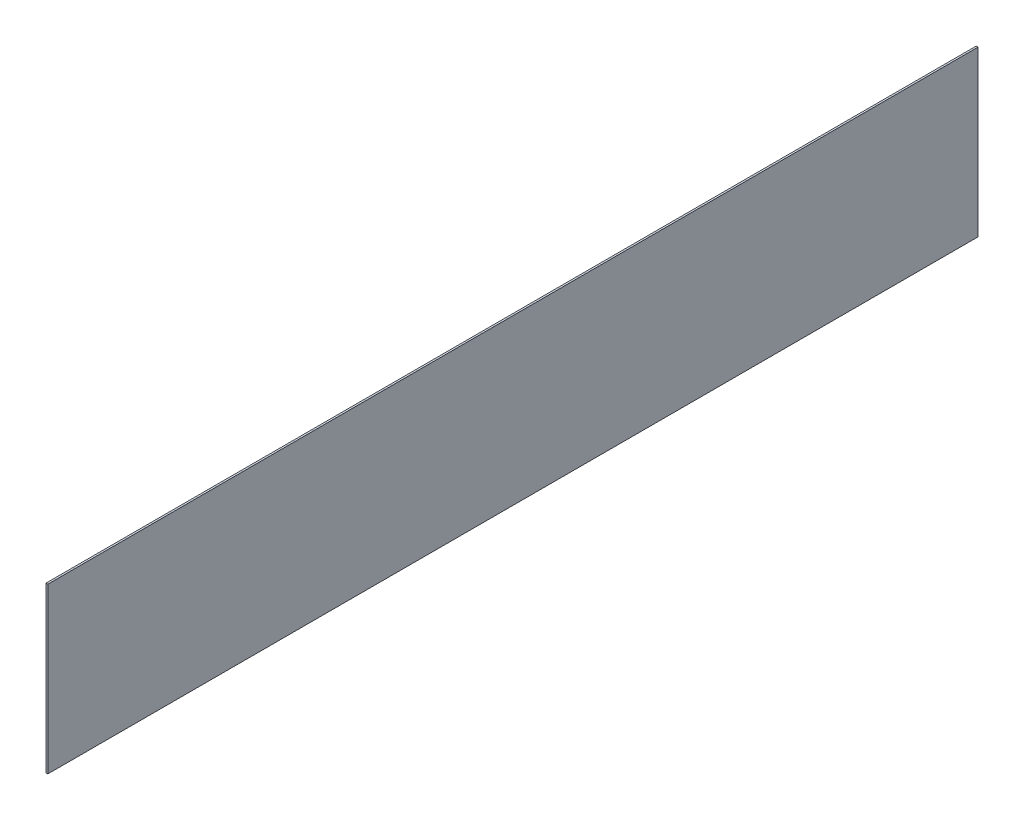
ISO-10303-21;
HEADER;
FILE_DESCRIPTION(('STEP AP214'),'2;1');
FILE_NAME('part.step','',(''),(''),'','','');
FILE_SCHEMA(('AUTOMOTIVE_DESIGN { 1 0 10303 214 1 1 1 1 }'));
ENDSEC;
DATA;
#1=APPLICATION_CONTEXT('core data for automotive mechanical design processes');
#2=APPLICATION_PROTOCOL_DEFINITION('international standard','automotive_design',2000,#1);
#3=PRODUCT_CONTEXT('',#1,'mechanical');
#4=PRODUCT('Part','Part','',(#3));
#5=PRODUCT_RELATED_PRODUCT_CATEGORY('part','',(#4));
#6=PRODUCT_DEFINITION_FORMATION('','',#4);
#7=PRODUCT_DEFINITION_CONTEXT('part definition',#1,'design');
#8=PRODUCT_DEFINITION('design','',#6,#7);
#9=PRODUCT_DEFINITION_SHAPE('','',#8);
#10=(LENGTH_UNIT() NAMED_UNIT(*) SI_UNIT(.MILLI.,.METRE.));
#11=(NAMED_UNIT(*) PLANE_ANGLE_UNIT() SI_UNIT($,.RADIAN.));
#12=(NAMED_UNIT(*) SI_UNIT($,.STERADIAN.) SOLID_ANGLE_UNIT());
#13=UNCERTAINTY_MEASURE_WITH_UNIT(LENGTH_MEASURE(1.E-05),#10,'distance_accuracy_value','');
#14=(GEOMETRIC_REPRESENTATION_CONTEXT(3) GLOBAL_UNCERTAINTY_ASSIGNED_CONTEXT((#13)) GLOBAL_UNIT_ASSIGNED_CONTEXT((#10,
#11,#12)) REPRESENTATION_CONTEXT('',''));
#15=CARTESIAN_POINT('',(0.,0.,0.));
#16=DIRECTION('',(0.,0.,1.));
#17=DIRECTION('',(1.,0.,0.));
#18=AXIS2_PLACEMENT_3D('',#15,#16,#17);
#19=CARTESIAN_POINT('',(5.99999999999993,529.999999999997,3000.));
#20=DIRECTION('',(-1.,0.,0.));
#21=DIRECTION('',(0.,-1.,0.));
#22=AXIS2_PLACEMENT_3D('',#19,#20,#21);
#23=PLANE('',#22);
#24=DIRECTION('',(0.,1.,0.));
#25=VECTOR('',#24,1.);
#26=CARTESIAN_POINT('',(5.99999999999993,529.999999999997,-3000.));
#27=LINE('',#26,#25);
#28=CARTESIAN_POINT('',(6.00000000000006,-530.000000000003,-3000.));
#29=VERTEX_POINT('',#28);
#30=CARTESIAN_POINT('',(5.99999999999993,529.999999999997,-3000.));
#31=VERTEX_POINT('',#30);
#32=EDGE_CURVE('E97',#29,#31,#27,.T.);
#33=ORIENTED_EDGE('',*,*,#32,.T.);
#34=DIRECTION('',(0.,0.,-1.));
#35=VECTOR('',#34,1.);
#36=CARTESIAN_POINT('',(5.99999999999993,529.999999999997,3000.));
#37=LINE('',#36,#35);
#38=CARTESIAN_POINT('',(5.99999999999993,529.999999999997,3000.));
#39=VERTEX_POINT('',#38);
#40=EDGE_CURVE('E11',#39,#31,#37,.T.);
#41=ORIENTED_EDGE('',*,*,#40,.F.);
#42=DIRECTION('',(0.,1.,0.));
#43=VECTOR('',#42,1.);
#44=CARTESIAN_POINT('',(5.99999999999993,529.999999999997,3000.));
#45=LINE('',#44,#43);
#46=CARTESIAN_POINT('',(6.00000000000006,-530.000000000003,3000.));
#47=VERTEX_POINT('',#46);
#48=EDGE_CURVE('E85',#47,#39,#45,.T.);
#49=ORIENTED_EDGE('',*,*,#48,.F.);
#50=DIRECTION('',(0.,0.,-1.));
#51=VECTOR('',#50,1.);
#52=CARTESIAN_POINT('',(6.00000000000006,-530.000000000003,3000.));
#53=LINE('',#52,#51);
#54=EDGE_CURVE('E93',#47,#29,#53,.T.);
#55=ORIENTED_EDGE('',*,*,#54,.T.);
#56=EDGE_LOOP('',(#33,#41,#49,#55));
#57=FACE_BOUND('',#56,.T.);
#58=ADVANCED_FACE('F34',(#57),#23,.F.);
#59=CARTESIAN_POINT('',(-6.00000000000007,529.999999999997,3000.));
#60=DIRECTION('',(0.,-1.,0.));
#61=DIRECTION('',(0.,0.,-1.));
#62=AXIS2_PLACEMENT_3D('',#59,#60,#61);
#63=PLANE('',#62);
#64=DIRECTION('',(-1.,0.,0.));
#65=VECTOR('',#64,1.);
#66=CARTESIAN_POINT('',(-6.00000000000007,529.999999999997,-3000.));
#67=LINE('',#66,#65);
#68=CARTESIAN_POINT('',(-6.00000000000007,529.999999999997,-3000.));
#69=VERTEX_POINT('',#68);
#70=EDGE_CURVE('E89',#31,#69,#67,.T.);
#71=ORIENTED_EDGE('',*,*,#70,.T.);
#72=DIRECTION('',(0.,0.,-1.));
#73=VECTOR('',#72,1.);
#74=CARTESIAN_POINT('',(-6.00000000000007,529.999999999997,3000.));
#75=LINE('',#74,#73);
#76=CARTESIAN_POINT('',(-6.00000000000007,529.999999999997,3000.));
#77=VERTEX_POINT('',#76);
#78=EDGE_CURVE('E42',#77,#69,#75,.T.);
#79=ORIENTED_EDGE('',*,*,#78,.F.);
#80=DIRECTION('',(-1.,0.,0.));
#81=VECTOR('',#80,1.);
#82=CARTESIAN_POINT('',(-6.00000000000007,529.999999999997,3000.));
#83=LINE('',#82,#81);
#84=EDGE_CURVE('E80',#39,#77,#83,.T.);
#85=ORIENTED_EDGE('',*,*,#84,.F.);
#86=ORIENTED_EDGE('',*,*,#40,.T.);
#87=EDGE_LOOP('',(#71,#79,#85,#86));
#88=FACE_BOUND('',#87,.T.);
#89=ADVANCED_FACE('F88',(#88),#63,.F.);
#90=CARTESIAN_POINT('',(-6.00000000000007,529.999999999997,3000.));
#91=DIRECTION('',(1.,0.,0.));
#92=DIRECTION('',(0.,1.,0.));
#93=AXIS2_PLACEMENT_3D('',#90,#91,#92);
#94=PLANE('',#93);
#95=DIRECTION('',(0.,-1.,0.));
#96=VECTOR('',#95,1.);
#97=CARTESIAN_POINT('',(-6.00000000000007,529.999999999997,-3000.));
#98=LINE('',#97,#96);
#99=CARTESIAN_POINT('',(-5.99999999999994,-530.000000000003,-3000.));
#100=VERTEX_POINT('',#99);
#101=EDGE_CURVE('E67',#69,#100,#98,.T.);
#102=ORIENTED_EDGE('',*,*,#101,.T.);
#103=DIRECTION('',(0.,0.,-1.));
#104=VECTOR('',#103,1.);
#105=CARTESIAN_POINT('',(-5.99999999999994,-530.000000000003,3000.));
#106=LINE('',#105,#104);
#107=CARTESIAN_POINT('',(-5.99999999999994,-530.000000000003,3000.));
#108=VERTEX_POINT('',#107);
#109=EDGE_CURVE('E90',#108,#100,#106,.T.);
#110=ORIENTED_EDGE('',*,*,#109,.F.);
#111=DIRECTION('',(0.,-1.,0.));
#112=VECTOR('',#111,1.);
#113=CARTESIAN_POINT('',(-6.00000000000007,529.999999999997,3000.));
#114=LINE('',#113,#112);
#115=EDGE_CURVE('E83',#77,#108,#114,.T.);
#116=ORIENTED_EDGE('',*,*,#115,.F.);
#117=ORIENTED_EDGE('',*,*,#78,.T.);
#118=EDGE_LOOP('',(#102,#110,#116,#117));
#119=FACE_BOUND('',#118,.T.);
#120=ADVANCED_FACE('F91',(#119),#94,.F.);
#121=CARTESIAN_POINT('',(-5.99999999999994,-530.000000000003,3000.));
#122=DIRECTION('',(0.,1.,0.));
#123=DIRECTION('',(0.,0.,1.));
#124=AXIS2_PLACEMENT_3D('',#121,#122,#123);
#125=PLANE('',#124);
#126=DIRECTION('',(1.,0.,0.));
#127=VECTOR('',#126,1.);
#128=CARTESIAN_POINT('',(-5.99999999999994,-530.000000000003,-3000.));
#129=LINE('',#128,#127);
#130=EDGE_CURVE('E73',#100,#29,#129,.T.);
#131=ORIENTED_EDGE('',*,*,#130,.T.);
#132=ORIENTED_EDGE('',*,*,#54,.F.);
#133=DIRECTION('',(1.,0.,0.));
#134=VECTOR('',#133,1.);
#135=CARTESIAN_POINT('',(-5.99999999999994,-530.000000000003,3000.));
#136=LINE('',#135,#134);
#137=EDGE_CURVE('E50',#108,#47,#136,.T.);
#138=ORIENTED_EDGE('',*,*,#137,.F.);
#139=ORIENTED_EDGE('',*,*,#109,.T.);
#140=EDGE_LOOP('',(#131,#132,#138,#139));
#141=FACE_BOUND('',#140,.T.);
#142=ADVANCED_FACE('F104',(#141),#125,.F.);
#143=CARTESIAN_POINT('',(0.,0.,3000.));
#144=DIRECTION('',(0.,0.,1.));
#145=DIRECTION('',(1.,0.,0.));
#146=AXIS2_PLACEMENT_3D('',#143,#144,#145);
#147=PLANE('',#146);
#148=ORIENTED_EDGE('',*,*,#48,.T.);
#149=ORIENTED_EDGE('',*,*,#84,.T.);
#150=ORIENTED_EDGE('',*,*,#115,.T.);
#151=ORIENTED_EDGE('',*,*,#137,.T.);
#152=EDGE_LOOP('',(#148,#149,#150,#151));
#153=FACE_BOUND('',#152,.T.);
#154=ADVANCED_FACE('F81',(#153),#147,.T.);
#155=CARTESIAN_POINT('',(0.,0.,-3000.));
#156=DIRECTION('',(0.,0.,1.));
#157=DIRECTION('',(1.,0.,0.));
#158=AXIS2_PLACEMENT_3D('',#155,#156,#157);
#159=PLANE('',#158);
#160=ORIENTED_EDGE('',*,*,#32,.F.);
#161=ORIENTED_EDGE('',*,*,#130,.F.);
#162=ORIENTED_EDGE('',*,*,#101,.F.);
#163=ORIENTED_EDGE('',*,*,#70,.F.);
#164=EDGE_LOOP('',(#160,#161,#162,#163));
#165=FACE_BOUND('',#164,.T.);
#166=ADVANCED_FACE('F107',(#165),#159,.F.);
#167=CLOSED_SHELL('',(#58,#89,#120,#142,#154,#166));
#168=MANIFOLD_SOLID_BREP('B2',#167);
#169=ADVANCED_BREP_SHAPE_REPRESENTATION('',(#18,#168),#14);
#170=SHAPE_DEFINITION_REPRESENTATION(#9,#169);
ENDSEC;
END-ISO-10303-21;
